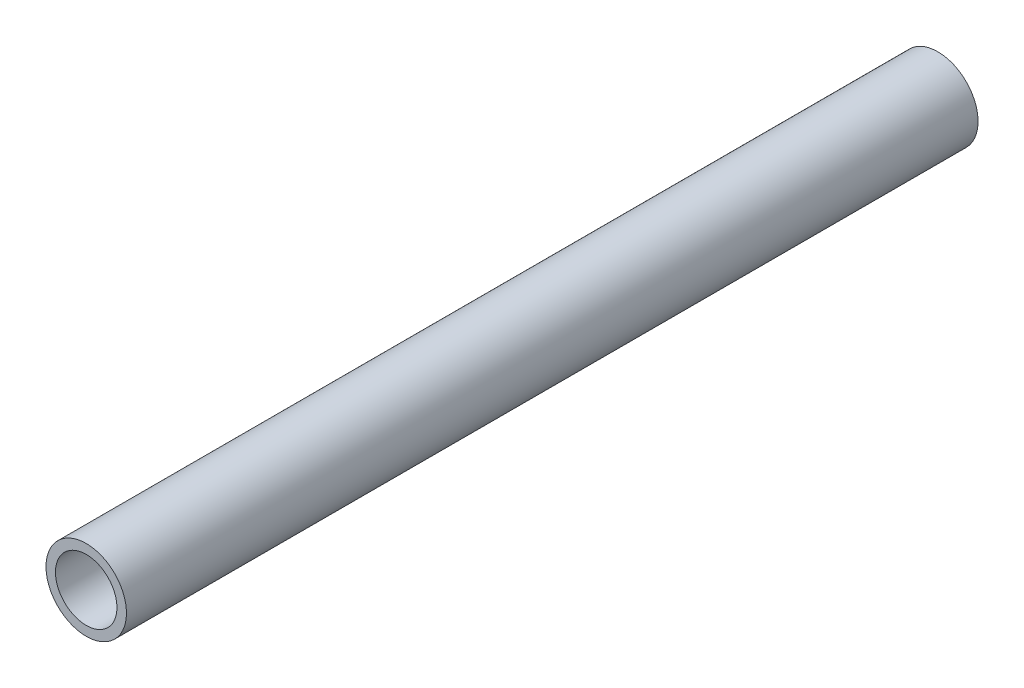
ISO-10303-21;
HEADER;
FILE_DESCRIPTION(('STEP AP214'),'2;1');
FILE_NAME('part.step','',(''),(''),'','','');
FILE_SCHEMA(('AUTOMOTIVE_DESIGN { 1 0 10303 214 1 1 1 1 }'));
ENDSEC;
DATA;
#1=APPLICATION_CONTEXT('core data for automotive mechanical design processes');
#2=APPLICATION_PROTOCOL_DEFINITION('international standard','automotive_design',2000,#1);
#3=PRODUCT_CONTEXT('',#1,'mechanical');
#4=PRODUCT('Part','Part','',(#3));
#5=PRODUCT_RELATED_PRODUCT_CATEGORY('part','',(#4));
#6=PRODUCT_DEFINITION_FORMATION('','',#4);
#7=PRODUCT_DEFINITION_CONTEXT('part definition',#1,'design');
#8=PRODUCT_DEFINITION('design','',#6,#7);
#9=PRODUCT_DEFINITION_SHAPE('','',#8);
#10=(LENGTH_UNIT() NAMED_UNIT(*) SI_UNIT(.MILLI.,.METRE.));
#11=(NAMED_UNIT(*) PLANE_ANGLE_UNIT() SI_UNIT($,.RADIAN.));
#12=(NAMED_UNIT(*) SI_UNIT($,.STERADIAN.) SOLID_ANGLE_UNIT());
#13=UNCERTAINTY_MEASURE_WITH_UNIT(LENGTH_MEASURE(1.E-05),#10,'distance_accuracy_value','');
#14=(GEOMETRIC_REPRESENTATION_CONTEXT(3) GLOBAL_UNCERTAINTY_ASSIGNED_CONTEXT((#13)) GLOBAL_UNIT_ASSIGNED_CONTEXT((#10,
#11,#12)) REPRESENTATION_CONTEXT('',''));
#15=CARTESIAN_POINT('',(0.,0.,0.));
#16=DIRECTION('',(0.,0.,1.));
#17=DIRECTION('',(1.,0.,0.));
#18=AXIS2_PLACEMENT_3D('',#15,#16,#17);
#19=CARTESIAN_POINT('',(0.,0.,90.));
#20=DIRECTION('',(0.,0.,1.));
#21=DIRECTION('',(1.,0.,0.));
#22=AXIS2_PLACEMENT_3D('',#19,#20,#21);
#23=PLANE('',#22);
#24=CARTESIAN_POINT('',(0.,0.,90.));
#25=DIRECTION('',(0.,0.,1.));
#26=DIRECTION('',(1.,0.,0.));
#27=AXIS2_PLACEMENT_3D('',#24,#25,#26);
#28=CIRCLE('',#27,4.25);
#29=CARTESIAN_POINT('',(-4.25,0.,90.));
#30=VERTEX_POINT('',#29);
#31=EDGE_CURVE('E10',#30,#30,#28,.T.);
#32=ORIENTED_EDGE('',*,*,#31,.T.);
#33=EDGE_LOOP('',(#32));
#34=FACE_BOUND('',#33,.T.);
#35=CARTESIAN_POINT('',(0.,0.,90.));
#36=DIRECTION('',(0.,0.,1.));
#37=DIRECTION('',(1.,0.,0.));
#38=AXIS2_PLACEMENT_3D('',#35,#36,#37);
#39=CIRCLE('',#38,3.25);
#40=CARTESIAN_POINT('',(-3.25,0.,90.));
#41=VERTEX_POINT('',#40);
#42=EDGE_CURVE('E42',#41,#41,#39,.T.);
#43=ORIENTED_EDGE('',*,*,#42,.F.);
#44=EDGE_LOOP('',(#43));
#45=FACE_BOUND('',#44,.T.);
#46=ADVANCED_FACE('F31',(#34,#45),#23,.T.);
#47=CARTESIAN_POINT('',(0.,0.,0.));
#48=DIRECTION('',(0.,0.,1.));
#49=DIRECTION('',(1.,0.,0.));
#50=AXIS2_PLACEMENT_3D('',#47,#48,#49);
#51=PLANE('',#50);
#52=CARTESIAN_POINT('',(0.,0.,0.));
#53=DIRECTION('',(0.,0.,1.));
#54=DIRECTION('',(1.,0.,0.));
#55=AXIS2_PLACEMENT_3D('',#52,#53,#54);
#56=CIRCLE('',#55,4.25);
#57=CARTESIAN_POINT('',(-4.25,0.,0.));
#58=VERTEX_POINT('',#57);
#59=EDGE_CURVE('E35',#58,#58,#56,.T.);
#60=ORIENTED_EDGE('',*,*,#59,.F.);
#61=EDGE_LOOP('',(#60));
#62=FACE_BOUND('',#61,.T.);
#63=CARTESIAN_POINT('',(0.,0.,0.));
#64=DIRECTION('',(0.,0.,1.));
#65=DIRECTION('',(1.,0.,0.));
#66=AXIS2_PLACEMENT_3D('',#63,#64,#65);
#67=CIRCLE('',#66,3.25);
#68=CARTESIAN_POINT('',(-3.25,0.,0.));
#69=VERTEX_POINT('',#68);
#70=EDGE_CURVE('E44',#69,#69,#67,.T.);
#71=ORIENTED_EDGE('',*,*,#70,.T.);
#72=EDGE_LOOP('',(#71));
#73=FACE_BOUND('',#72,.T.);
#74=ADVANCED_FACE('F54',(#62,#73),#51,.F.);
#75=CARTESIAN_POINT('',(0.,0.,90.));
#76=DIRECTION('',(0.,0.,-1.));
#77=DIRECTION('',(-1.,0.,0.));
#78=AXIS2_PLACEMENT_3D('',#75,#76,#77);
#79=CYLINDRICAL_SURFACE('',#78,4.25);
#80=CARTESIAN_POINT('',(-4.25,0.,90.));
#81=CARTESIAN_POINT('',(-4.25,0.,89.0625));
#82=CARTESIAN_POINT('',(-4.25,0.,88.125));
#83=CARTESIAN_POINT('',(-4.25,0.,86.25));
#84=CARTESIAN_POINT('',(-4.25,0.,85.3125));
#85=CARTESIAN_POINT('',(-4.25,0.,83.4375));
#86=CARTESIAN_POINT('',(-4.25,0.,82.5));
#87=CARTESIAN_POINT('',(-4.25,0.,80.625));
#88=CARTESIAN_POINT('',(-4.25,0.,79.6875));
#89=CARTESIAN_POINT('',(-4.25,0.,77.8125));
#90=CARTESIAN_POINT('',(-4.25,0.,76.875));
#91=CARTESIAN_POINT('',(-4.25,0.,75.));
#92=CARTESIAN_POINT('',(-4.25,0.,74.0625));
#93=CARTESIAN_POINT('',(-4.25,0.,72.1875));
#94=CARTESIAN_POINT('',(-4.25,0.,71.25));
#95=CARTESIAN_POINT('',(-4.25,0.,69.375));
#96=CARTESIAN_POINT('',(-4.25,0.,68.4375));
#97=CARTESIAN_POINT('',(-4.25,0.,66.5625));
#98=CARTESIAN_POINT('',(-4.25,0.,65.625));
#99=CARTESIAN_POINT('',(-4.25,0.,63.75));
#100=CARTESIAN_POINT('',(-4.25,0.,62.8125));
#101=CARTESIAN_POINT('',(-4.25,0.,60.9375));
#102=CARTESIAN_POINT('',(-4.25,0.,60.));
#103=CARTESIAN_POINT('',(-4.25,0.,58.125));
#104=CARTESIAN_POINT('',(-4.25,0.,57.1875));
#105=CARTESIAN_POINT('',(-4.25,0.,55.3125));
#106=CARTESIAN_POINT('',(-4.25,0.,54.375));
#107=CARTESIAN_POINT('',(-4.25,0.,52.5));
#108=CARTESIAN_POINT('',(-4.25,0.,51.5625));
#109=CARTESIAN_POINT('',(-4.25,0.,49.6875));
#110=CARTESIAN_POINT('',(-4.25,0.,48.75));
#111=CARTESIAN_POINT('',(-4.25,0.,46.875));
#112=CARTESIAN_POINT('',(-4.25,0.,45.9375));
#113=CARTESIAN_POINT('',(-4.25,0.,44.0625));
#114=CARTESIAN_POINT('',(-4.25,0.,43.125));
#115=CARTESIAN_POINT('',(-4.25,0.,41.25));
#116=CARTESIAN_POINT('',(-4.25,0.,40.3125));
#117=CARTESIAN_POINT('',(-4.25,0.,38.4375));
#118=CARTESIAN_POINT('',(-4.25,0.,37.5));
#119=CARTESIAN_POINT('',(-4.25,0.,35.625));
#120=CARTESIAN_POINT('',(-4.25,0.,34.6875));
#121=CARTESIAN_POINT('',(-4.25,0.,32.8125));
#122=CARTESIAN_POINT('',(-4.25,0.,31.875));
#123=CARTESIAN_POINT('',(-4.25,0.,30.));
#124=CARTESIAN_POINT('',(-4.25,0.,29.0625));
#125=CARTESIAN_POINT('',(-4.25,0.,27.1875));
#126=CARTESIAN_POINT('',(-4.25,0.,26.25));
#127=CARTESIAN_POINT('',(-4.25,0.,24.375));
#128=CARTESIAN_POINT('',(-4.25,0.,23.4375));
#129=CARTESIAN_POINT('',(-4.25,0.,21.5625));
#130=CARTESIAN_POINT('',(-4.25,0.,20.625));
#131=CARTESIAN_POINT('',(-4.25,0.,18.75));
#132=CARTESIAN_POINT('',(-4.25,0.,17.8125));
#133=CARTESIAN_POINT('',(-4.25,0.,15.9375));
#134=CARTESIAN_POINT('',(-4.25,0.,15.));
#135=CARTESIAN_POINT('',(-4.25,0.,13.125));
#136=CARTESIAN_POINT('',(-4.25,0.,12.1875));
#137=CARTESIAN_POINT('',(-4.25,0.,10.3125));
#138=CARTESIAN_POINT('',(-4.25,0.,9.37499999999999));
#139=CARTESIAN_POINT('',(-4.25,0.,7.49999999999999));
#140=CARTESIAN_POINT('',(-4.25,0.,6.56249999999999));
#141=CARTESIAN_POINT('',(-4.25,0.,4.68749999999999));
#142=CARTESIAN_POINT('',(-4.25,0.,3.74999999999998));
#143=CARTESIAN_POINT('',(-4.25,0.,1.87499999999998));
#144=CARTESIAN_POINT('',(-4.25,0.,0.937499999999986));
#145=CARTESIAN_POINT('',(-4.25,0.,0.));
#146=B_SPLINE_CURVE_WITH_KNOTS('',3,(#80,#81,#82,#83,#84,#85,#86,#87,#88,#89,#90,#91,#92,#93,
#94,#95,#96,#97,#98,#99,#100,#101,#102,#103,#104,#105,#106,#107,#108,#109,#110,#111,#112,#113,
#114,#115,#116,#117,#118,#119,#120,#121,#122,#123,#124,#125,#126,#127,#128,#129,#130,#131,#132,
#133,#134,#135,#136,#137,#138,#139,#140,#141,#142,#143,#144,#145),.UNSPECIFIED.,.F.,.F.,(4,2,2,
2,2,2,2,2,2,2,2,2,2,2,2,2,2,2,2,2,2,2,2,2,2,2,2,2,2,2,2,2,4),(0.,2.81250000000001,
5.62500000000001,8.43750000000001,11.25,14.0625,16.875,19.6875,22.5,25.3125,28.125,30.9375,
33.75,36.5625,39.375,42.1875,45.,47.8125,50.625,53.4375,56.25,59.0625,61.875,64.6875,67.5,
70.3125,73.125,75.9375,78.75,81.5625,84.375,87.1875,90.),.UNSPECIFIED.);
#147=EDGE_CURVE('BSEAM33',#30,#58,#146,.T.);
#148=ORIENTED_EDGE('',*,*,#31,.F.);
#149=ORIENTED_EDGE('',*,*,#59,.T.);
#150=ORIENTED_EDGE('',*,*,#147,.T.);
#151=ORIENTED_EDGE('',*,*,#147,.F.);
#152=EDGE_LOOP('',(#148,#150,#149,#151));
#153=FACE_BOUND('',#152,.T.);
#154=ADVANCED_FACE('F33',(#153),#79,.T.);
#155=CARTESIAN_POINT('',(0.,0.,90.));
#156=DIRECTION('',(0.,0.,-1.));
#157=DIRECTION('',(-1.,0.,0.));
#158=AXIS2_PLACEMENT_3D('',#155,#156,#157);
#159=CYLINDRICAL_SURFACE('',#158,3.25);
#160=CARTESIAN_POINT('',(-3.25,0.,90.));
#161=CARTESIAN_POINT('',(-3.25,0.,89.0625));
#162=CARTESIAN_POINT('',(-3.25,0.,88.125));
#163=CARTESIAN_POINT('',(-3.25,0.,86.25));
#164=CARTESIAN_POINT('',(-3.25,0.,85.3125));
#165=CARTESIAN_POINT('',(-3.25,0.,83.4375));
#166=CARTESIAN_POINT('',(-3.25,0.,82.5));
#167=CARTESIAN_POINT('',(-3.25,0.,80.625));
#168=CARTESIAN_POINT('',(-3.25,0.,79.6875));
#169=CARTESIAN_POINT('',(-3.25,0.,77.8125));
#170=CARTESIAN_POINT('',(-3.25,0.,76.875));
#171=CARTESIAN_POINT('',(-3.25,0.,75.));
#172=CARTESIAN_POINT('',(-3.25,0.,74.0625));
#173=CARTESIAN_POINT('',(-3.25,0.,72.1875));
#174=CARTESIAN_POINT('',(-3.25,0.,71.25));
#175=CARTESIAN_POINT('',(-3.25,0.,69.375));
#176=CARTESIAN_POINT('',(-3.25,0.,68.4375));
#177=CARTESIAN_POINT('',(-3.25,0.,66.5625));
#178=CARTESIAN_POINT('',(-3.25,0.,65.625));
#179=CARTESIAN_POINT('',(-3.25,0.,63.75));
#180=CARTESIAN_POINT('',(-3.25,0.,62.8125));
#181=CARTESIAN_POINT('',(-3.25,0.,60.9375));
#182=CARTESIAN_POINT('',(-3.25,0.,60.));
#183=CARTESIAN_POINT('',(-3.25,0.,58.125));
#184=CARTESIAN_POINT('',(-3.25,0.,57.1875));
#185=CARTESIAN_POINT('',(-3.25,0.,55.3125));
#186=CARTESIAN_POINT('',(-3.25,0.,54.375));
#187=CARTESIAN_POINT('',(-3.25,0.,52.5));
#188=CARTESIAN_POINT('',(-3.25,0.,51.5625));
#189=CARTESIAN_POINT('',(-3.25,0.,49.6875));
#190=CARTESIAN_POINT('',(-3.25,0.,48.75));
#191=CARTESIAN_POINT('',(-3.25,0.,46.875));
#192=CARTESIAN_POINT('',(-3.25,0.,45.9375));
#193=CARTESIAN_POINT('',(-3.25,0.,44.0625));
#194=CARTESIAN_POINT('',(-3.25,0.,43.125));
#195=CARTESIAN_POINT('',(-3.25,0.,41.25));
#196=CARTESIAN_POINT('',(-3.25,0.,40.3125));
#197=CARTESIAN_POINT('',(-3.25,0.,38.4375));
#198=CARTESIAN_POINT('',(-3.25,0.,37.5));
#199=CARTESIAN_POINT('',(-3.25,0.,35.625));
#200=CARTESIAN_POINT('',(-3.25,0.,34.6875));
#201=CARTESIAN_POINT('',(-3.25,0.,32.8125));
#202=CARTESIAN_POINT('',(-3.25,0.,31.875));
#203=CARTESIAN_POINT('',(-3.25,0.,30.));
#204=CARTESIAN_POINT('',(-3.25,0.,29.0625));
#205=CARTESIAN_POINT('',(-3.25,0.,27.1875));
#206=CARTESIAN_POINT('',(-3.25,0.,26.25));
#207=CARTESIAN_POINT('',(-3.25,0.,24.375));
#208=CARTESIAN_POINT('',(-3.25,0.,23.4375));
#209=CARTESIAN_POINT('',(-3.25,0.,21.5625));
#210=CARTESIAN_POINT('',(-3.25,0.,20.625));
#211=CARTESIAN_POINT('',(-3.25,0.,18.75));
#212=CARTESIAN_POINT('',(-3.25,0.,17.8125));
#213=CARTESIAN_POINT('',(-3.25,0.,15.9375));
#214=CARTESIAN_POINT('',(-3.25,0.,15.));
#215=CARTESIAN_POINT('',(-3.25,0.,13.125));
#216=CARTESIAN_POINT('',(-3.25,0.,12.1875));
#217=CARTESIAN_POINT('',(-3.25,0.,10.3125));
#218=CARTESIAN_POINT('',(-3.25,0.,9.37499999999999));
#219=CARTESIAN_POINT('',(-3.25,0.,7.49999999999999));
#220=CARTESIAN_POINT('',(-3.25,0.,6.56249999999999));
#221=CARTESIAN_POINT('',(-3.25,0.,4.68749999999999));
#222=CARTESIAN_POINT('',(-3.25,0.,3.74999999999998));
#223=CARTESIAN_POINT('',(-3.25,0.,1.87499999999998));
#224=CARTESIAN_POINT('',(-3.25,0.,0.937499999999986));
#225=CARTESIAN_POINT('',(-3.25,0.,0.));
#226=B_SPLINE_CURVE_WITH_KNOTS('',3,(#160,#161,#162,#163,#164,#165,#166,#167,#168,#169,#170,
#171,#172,#173,#174,#175,#176,#177,#178,#179,#180,#181,#182,#183,#184,#185,#186,#187,#188,#189,
#190,#191,#192,#193,#194,#195,#196,#197,#198,#199,#200,#201,#202,#203,#204,#205,#206,#207,#208,
#209,#210,#211,#212,#213,#214,#215,#216,#217,#218,#219,#220,#221,#222,#223,#224,#225),
.UNSPECIFIED.,.F.,.F.,(4,2,2,2,2,2,2,2,2,2,2,2,2,2,2,2,2,2,2,2,2,2,2,2,2,2,2,2,2,2,2,2,4),(0.,
2.81250000000001,5.62500000000001,8.43750000000001,11.25,14.0625,16.875,19.6875,22.5,25.3125,
28.125,30.9375,33.75,36.5625,39.375,42.1875,45.,47.8125,50.625,53.4375,56.25,59.0625,61.875,
64.6875,67.5,70.3125,73.125,75.9375,78.75,81.5625,84.375,87.1875,90.),.UNSPECIFIED.);
#227=EDGE_CURVE('BSEAM50',#41,#69,#226,.T.);
#228=ORIENTED_EDGE('',*,*,#42,.T.);
#229=ORIENTED_EDGE('',*,*,#70,.F.);
#230=ORIENTED_EDGE('',*,*,#227,.T.);
#231=ORIENTED_EDGE('',*,*,#227,.F.);
#232=EDGE_LOOP('',(#228,#230,#229,#231));
#233=FACE_BOUND('',#232,.T.);
#234=ADVANCED_FACE('F50',(#233),#159,.F.);
#235=CLOSED_SHELL('',(#46,#74,#154,#234));
#236=MANIFOLD_SOLID_BREP('B2',#235);
#237=ADVANCED_BREP_SHAPE_REPRESENTATION('',(#18,#236),#14);
#238=SHAPE_DEFINITION_REPRESENTATION(#9,#237);
ENDSEC;
END-ISO-10303-21;
